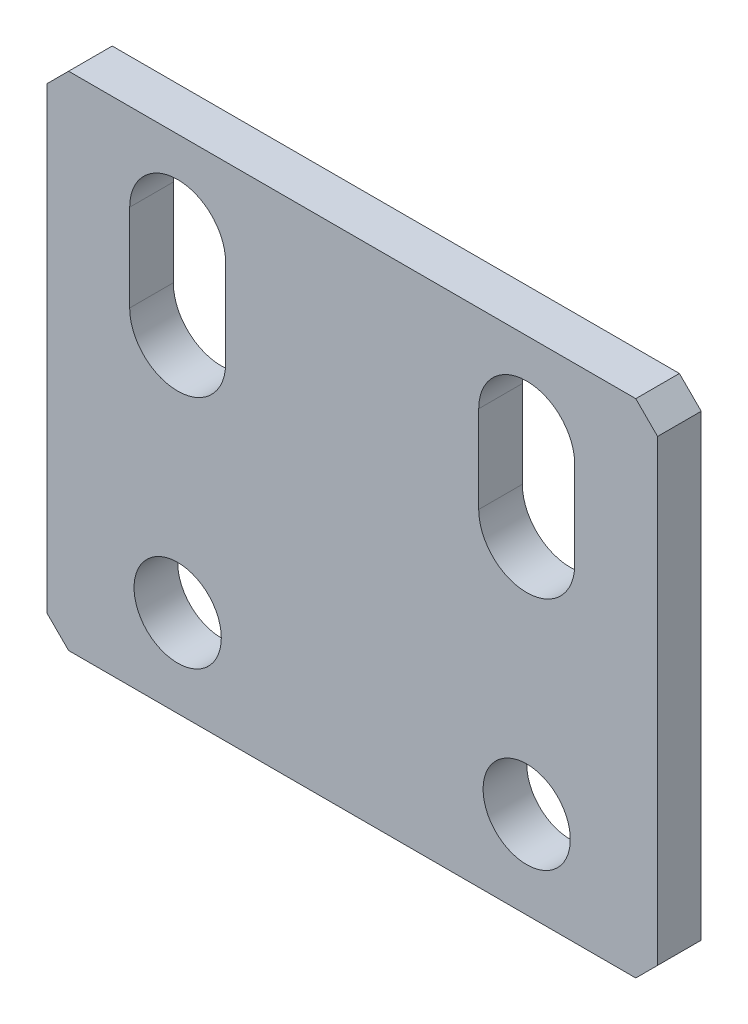
ISO-10303-21;
HEADER;
FILE_DESCRIPTION(('STEP AP214'),'2;1');
FILE_NAME('part.step','',(''),(''),'','','');
FILE_SCHEMA(('AUTOMOTIVE_DESIGN { 1 0 10303 214 1 1 1 1 }'));
ENDSEC;
DATA;
#1=APPLICATION_CONTEXT('core data for automotive mechanical design processes');
#2=APPLICATION_PROTOCOL_DEFINITION('international standard','automotive_design',2000,#1);
#3=PRODUCT_CONTEXT('',#1,'mechanical');
#4=PRODUCT('Part','Part','',(#3));
#5=PRODUCT_RELATED_PRODUCT_CATEGORY('part','',(#4));
#6=PRODUCT_DEFINITION_FORMATION('','',#4);
#7=PRODUCT_DEFINITION_CONTEXT('part definition',#1,'design');
#8=PRODUCT_DEFINITION('design','',#6,#7);
#9=PRODUCT_DEFINITION_SHAPE('','',#8);
#10=(LENGTH_UNIT() NAMED_UNIT(*) SI_UNIT(.MILLI.,.METRE.));
#11=(NAMED_UNIT(*) PLANE_ANGLE_UNIT() SI_UNIT($,.RADIAN.));
#12=(NAMED_UNIT(*) SI_UNIT($,.STERADIAN.) SOLID_ANGLE_UNIT());
#13=UNCERTAINTY_MEASURE_WITH_UNIT(LENGTH_MEASURE(1.E-05),#10,'distance_accuracy_value','');
#14=(GEOMETRIC_REPRESENTATION_CONTEXT(3) GLOBAL_UNCERTAINTY_ASSIGNED_CONTEXT((#13)) GLOBAL_UNIT_ASSIGNED_CONTEXT((#10,
#11,#12)) REPRESENTATION_CONTEXT('',''));
#15=CARTESIAN_POINT('',(0.,0.,0.));
#16=DIRECTION('',(0.,0.,1.));
#17=DIRECTION('',(1.,0.,0.));
#18=AXIS2_PLACEMENT_3D('',#15,#16,#17);
#19=CARTESIAN_POINT('',(0.,0.,2.));
#20=DIRECTION('',(1.,0.,0.));
#21=DIRECTION('',(0.,0.,-1.));
#22=AXIS2_PLACEMENT_3D('',#19,#20,#21);
#23=PLANE('',#22);
#24=DIRECTION('',(0.,-1.,0.));
#25=VECTOR('',#24,1.);
#26=CARTESIAN_POINT('',(0.,0.,2.));
#27=LINE('',#26,#25);
#28=CARTESIAN_POINT('',(0.,22.,2.));
#29=VERTEX_POINT('',#28);
#30=CARTESIAN_POINT('',(0.,1.00000000000001,2.));
#31=VERTEX_POINT('',#30);
#32=EDGE_CURVE('E235',#29,#31,#27,.T.);
#33=ORIENTED_EDGE('',*,*,#32,.F.);
#34=DIRECTION('',(0.,0.,-1.));
#35=VECTOR('',#34,1.);
#36=CARTESIAN_POINT('',(0.,22.,2.));
#37=LINE('',#36,#35);
#38=CARTESIAN_POINT('',(0.,22.,0.));
#39=VERTEX_POINT('',#38);
#40=EDGE_CURVE('E282',#29,#39,#37,.T.);
#41=ORIENTED_EDGE('',*,*,#40,.T.);
#42=DIRECTION('',(0.,-1.,0.));
#43=VECTOR('',#42,1.);
#44=CARTESIAN_POINT('',(0.,0.,0.));
#45=LINE('',#44,#43);
#46=CARTESIAN_POINT('',(0.,1.00000000000001,0.));
#47=VERTEX_POINT('',#46);
#48=EDGE_CURVE('E228',#39,#47,#45,.T.);
#49=ORIENTED_EDGE('',*,*,#48,.T.);
#50=DIRECTION('',(0.,0.,1.));
#51=VECTOR('',#50,1.);
#52=CARTESIAN_POINT('',(0.,1.00000000000001,2.));
#53=LINE('',#52,#51);
#54=EDGE_CURVE('E280',#47,#31,#53,.T.);
#55=ORIENTED_EDGE('',*,*,#54,.T.);
#56=EDGE_LOOP('',(#33,#41,#49,#55));
#57=FACE_BOUND('',#56,.T.);
#58=ADVANCED_FACE('F33',(#57),#23,.F.);
#59=CARTESIAN_POINT('',(0.,0.,2.));
#60=DIRECTION('',(0.,1.,0.));
#61=DIRECTION('',(0.,0.,1.));
#62=AXIS2_PLACEMENT_3D('',#59,#60,#61);
#63=PLANE('',#62);
#64=DIRECTION('',(1.,0.,0.));
#65=VECTOR('',#64,1.);
#66=CARTESIAN_POINT('',(0.,0.,2.));
#67=LINE('',#66,#65);
#68=CARTESIAN_POINT('',(1.,0.,2.));
#69=VERTEX_POINT('',#68);
#70=CARTESIAN_POINT('',(27.,0.,2.));
#71=VERTEX_POINT('',#70);
#72=EDGE_CURVE('E237',#69,#71,#67,.T.);
#73=ORIENTED_EDGE('',*,*,#72,.F.);
#74=DIRECTION('',(0.,0.,-1.));
#75=VECTOR('',#74,1.);
#76=CARTESIAN_POINT('',(1.,0.,2.));
#77=LINE('',#76,#75);
#78=CARTESIAN_POINT('',(1.,0.,0.));
#79=VERTEX_POINT('',#78);
#80=EDGE_CURVE('E11',#69,#79,#77,.T.);
#81=ORIENTED_EDGE('',*,*,#80,.T.);
#82=DIRECTION('',(1.,0.,0.));
#83=VECTOR('',#82,1.);
#84=CARTESIAN_POINT('',(0.,0.,0.));
#85=LINE('',#84,#83);
#86=CARTESIAN_POINT('',(27.,0.,0.));
#87=VERTEX_POINT('',#86);
#88=EDGE_CURVE('E249',#79,#87,#85,.T.);
#89=ORIENTED_EDGE('',*,*,#88,.T.);
#90=DIRECTION('',(0.,0.,1.));
#91=VECTOR('',#90,1.);
#92=CARTESIAN_POINT('',(27.,0.,2.));
#93=LINE('',#92,#91);
#94=EDGE_CURVE('E41',#87,#71,#93,.T.);
#95=ORIENTED_EDGE('',*,*,#94,.T.);
#96=EDGE_LOOP('',(#73,#81,#89,#95));
#97=FACE_BOUND('',#96,.T.);
#98=ADVANCED_FACE('F297',(#97),#63,.F.);
#99=CARTESIAN_POINT('',(28.,0.,2.));
#100=DIRECTION('',(-1.,0.,0.));
#101=DIRECTION('',(0.,0.,1.));
#102=AXIS2_PLACEMENT_3D('',#99,#100,#101);
#103=PLANE('',#102);
#104=DIRECTION('',(0.,1.,0.));
#105=VECTOR('',#104,1.);
#106=CARTESIAN_POINT('',(28.,0.,0.));
#107=LINE('',#106,#105);
#108=CARTESIAN_POINT('',(28.,1.,0.));
#109=VERTEX_POINT('',#108);
#110=CARTESIAN_POINT('',(28.,22.,0.));
#111=VERTEX_POINT('',#110);
#112=EDGE_CURVE('E251',#109,#111,#107,.T.);
#113=ORIENTED_EDGE('',*,*,#112,.T.);
#114=DIRECTION('',(0.,0.,1.));
#115=VECTOR('',#114,1.);
#116=CARTESIAN_POINT('',(28.,22.,2.));
#117=LINE('',#116,#115);
#118=CARTESIAN_POINT('',(28.,22.,2.));
#119=VERTEX_POINT('',#118);
#120=EDGE_CURVE('E271',#111,#119,#117,.T.);
#121=ORIENTED_EDGE('',*,*,#120,.T.);
#122=DIRECTION('',(0.,1.,0.));
#123=VECTOR('',#122,1.);
#124=CARTESIAN_POINT('',(28.,0.,2.));
#125=LINE('',#124,#123);
#126=CARTESIAN_POINT('',(28.,1.,2.));
#127=VERTEX_POINT('',#126);
#128=EDGE_CURVE('E240',#127,#119,#125,.T.);
#129=ORIENTED_EDGE('',*,*,#128,.F.);
#130=DIRECTION('',(0.,0.,-1.));
#131=VECTOR('',#130,1.);
#132=CARTESIAN_POINT('',(28.,1.,2.));
#133=LINE('',#132,#131);
#134=EDGE_CURVE('E268',#127,#109,#133,.T.);
#135=ORIENTED_EDGE('',*,*,#134,.T.);
#136=EDGE_LOOP('',(#113,#121,#129,#135));
#137=FACE_BOUND('',#136,.T.);
#138=ADVANCED_FACE('F305',(#137),#103,.F.);
#139=CARTESIAN_POINT('',(0.,23.,2.));
#140=DIRECTION('',(0.,-1.,0.));
#141=DIRECTION('',(0.,0.,-1.));
#142=AXIS2_PLACEMENT_3D('',#139,#140,#141);
#143=PLANE('',#142);
#144=DIRECTION('',(-1.,0.,0.));
#145=VECTOR('',#144,1.);
#146=CARTESIAN_POINT('',(0.,23.,2.));
#147=LINE('',#146,#145);
#148=CARTESIAN_POINT('',(27.,23.,2.));
#149=VERTEX_POINT('',#148);
#150=CARTESIAN_POINT('',(1.,23.,2.));
#151=VERTEX_POINT('',#150);
#152=EDGE_CURVE('E243',#149,#151,#147,.T.);
#153=ORIENTED_EDGE('',*,*,#152,.F.);
#154=DIRECTION('',(0.,0.,-1.));
#155=VECTOR('',#154,1.);
#156=CARTESIAN_POINT('',(27.,23.,2.));
#157=LINE('',#156,#155);
#158=CARTESIAN_POINT('',(27.,23.,0.));
#159=VERTEX_POINT('',#158);
#160=EDGE_CURVE('E257',#149,#159,#157,.T.);
#161=ORIENTED_EDGE('',*,*,#160,.T.);
#162=DIRECTION('',(-1.,0.,0.));
#163=VECTOR('',#162,1.);
#164=CARTESIAN_POINT('',(0.,23.,0.));
#165=LINE('',#164,#163);
#166=CARTESIAN_POINT('',(1.,23.,0.));
#167=VERTEX_POINT('',#166);
#168=EDGE_CURVE('E238',#159,#167,#165,.T.);
#169=ORIENTED_EDGE('',*,*,#168,.T.);
#170=DIRECTION('',(0.,0.,1.));
#171=VECTOR('',#170,1.);
#172=CARTESIAN_POINT('',(1.,23.,2.));
#173=LINE('',#172,#171);
#174=EDGE_CURVE('E246',#167,#151,#173,.T.);
#175=ORIENTED_EDGE('',*,*,#174,.T.);
#176=EDGE_LOOP('',(#153,#161,#169,#175));
#177=FACE_BOUND('',#176,.T.);
#178=ADVANCED_FACE('F313',(#177),#143,.F.);
#179=CARTESIAN_POINT('',(0.,0.,2.));
#180=DIRECTION('',(0.,0.,-1.));
#181=DIRECTION('',(-1.,0.,0.));
#182=AXIS2_PLACEMENT_3D('',#179,#180,#181);
#183=PLANE('',#182);
#184=DIRECTION('',(0.,-1.,0.));
#185=VECTOR('',#184,1.);
#186=CARTESIAN_POINT('',(19.8,19.,2.));
#187=LINE('',#186,#185);
#188=CARTESIAN_POINT('',(19.8,19.,2.));
#189=VERTEX_POINT('',#188);
#190=CARTESIAN_POINT('',(19.8,15.,2.));
#191=VERTEX_POINT('',#190);
#192=EDGE_CURVE('E181',#189,#191,#187,.T.);
#193=ORIENTED_EDGE('',*,*,#192,.F.);
#194=CARTESIAN_POINT('',(22.,19.,2.));
#195=DIRECTION('',(0.,0.,1.));
#196=DIRECTION('',(-1.,0.,0.));
#197=AXIS2_PLACEMENT_3D('',#194,#195,#196);
#198=CIRCLE('',#197,2.2);
#199=CARTESIAN_POINT('',(24.2,19.,2.));
#200=VERTEX_POINT('',#199);
#201=EDGE_CURVE('E154',#200,#189,#198,.T.);
#202=ORIENTED_EDGE('',*,*,#201,.F.);
#203=DIRECTION('',(0.,1.,0.));
#204=VECTOR('',#203,1.);
#205=CARTESIAN_POINT('',(24.2,19.,2.));
#206=LINE('',#205,#204);
#207=CARTESIAN_POINT('',(24.2,15.,2.));
#208=VERTEX_POINT('',#207);
#209=EDGE_CURVE('E172',#208,#200,#206,.T.);
#210=ORIENTED_EDGE('',*,*,#209,.F.);
#211=CARTESIAN_POINT('',(22.,15.,2.));
#212=DIRECTION('',(0.,0.,1.));
#213=DIRECTION('',(-1.,0.,0.));
#214=AXIS2_PLACEMENT_3D('',#211,#212,#213);
#215=CIRCLE('',#214,2.2);
#216=EDGE_CURVE('E175',#191,#208,#215,.T.);
#217=ORIENTED_EDGE('',*,*,#216,.F.);
#218=EDGE_LOOP('',(#193,#202,#210,#217));
#219=FACE_BOUND('',#218,.T.);
#220=CARTESIAN_POINT('',(6.,4.,2.));
#221=DIRECTION('',(0.,0.,1.));
#222=DIRECTION('',(1.,0.,0.));
#223=AXIS2_PLACEMENT_3D('',#220,#221,#222);
#224=CIRCLE('',#223,2.);
#225=CARTESIAN_POINT('',(8.,4.,2.));
#226=VERTEX_POINT('',#225);
#227=EDGE_CURVE('E194',#226,#226,#224,.T.);
#228=ORIENTED_EDGE('',*,*,#227,.F.);
#229=EDGE_LOOP('',(#228));
#230=FACE_BOUND('',#229,.T.);
#231=CARTESIAN_POINT('',(22.,4.,2.));
#232=DIRECTION('',(0.,0.,1.));
#233=DIRECTION('',(-1.,0.,0.));
#234=AXIS2_PLACEMENT_3D('',#231,#232,#233);
#235=CIRCLE('',#234,2.);
#236=CARTESIAN_POINT('',(20.,4.,2.));
#237=VERTEX_POINT('',#236);
#238=EDGE_CURVE('E200',#237,#237,#235,.T.);
#239=ORIENTED_EDGE('',*,*,#238,.F.);
#240=EDGE_LOOP('',(#239));
#241=FACE_BOUND('',#240,.T.);
#242=DIRECTION('',(0.,-1.,0.));
#243=VECTOR('',#242,1.);
#244=CARTESIAN_POINT('',(3.8,19.,2.));
#245=LINE('',#244,#243);
#246=CARTESIAN_POINT('',(3.8,19.,2.));
#247=VERTEX_POINT('',#246);
#248=CARTESIAN_POINT('',(3.8,15.,2.));
#249=VERTEX_POINT('',#248);
#250=EDGE_CURVE('E218',#247,#249,#245,.T.);
#251=ORIENTED_EDGE('',*,*,#250,.F.);
#252=CARTESIAN_POINT('',(6.,19.,2.));
#253=DIRECTION('',(0.,0.,1.));
#254=DIRECTION('',(1.,0.,0.));
#255=AXIS2_PLACEMENT_3D('',#252,#253,#254);
#256=CIRCLE('',#255,2.2);
#257=CARTESIAN_POINT('',(8.2,19.,2.));
#258=VERTEX_POINT('',#257);
#259=EDGE_CURVE('E188',#258,#247,#256,.T.);
#260=ORIENTED_EDGE('',*,*,#259,.F.);
#261=DIRECTION('',(0.,1.,0.));
#262=VECTOR('',#261,1.);
#263=CARTESIAN_POINT('',(8.2,19.,2.));
#264=LINE('',#263,#262);
#265=CARTESIAN_POINT('',(8.2,15.,2.));
#266=VERTEX_POINT('',#265);
#267=EDGE_CURVE('E207',#266,#258,#264,.T.);
#268=ORIENTED_EDGE('',*,*,#267,.F.);
#269=CARTESIAN_POINT('',(6.,15.,2.));
#270=DIRECTION('',(0.,0.,1.));
#271=DIRECTION('',(1.,0.,0.));
#272=AXIS2_PLACEMENT_3D('',#269,#270,#271);
#273=CIRCLE('',#272,2.2);
#274=EDGE_CURVE('E221',#249,#266,#273,.T.);
#275=ORIENTED_EDGE('',*,*,#274,.F.);
#276=EDGE_LOOP('',(#251,#260,#268,#275));
#277=FACE_BOUND('',#276,.T.);
#278=ORIENTED_EDGE('',*,*,#128,.T.);
#279=DIRECTION('',(0.707106781186546,-0.707106781186549,0.));
#280=VECTOR('',#279,1.);
#281=CARTESIAN_POINT('',(27.,23.,2.));
#282=LINE('',#281,#280);
#283=EDGE_CURVE('E278',#119,#149,#282,.F.);
#284=ORIENTED_EDGE('',*,*,#283,.T.);
#285=ORIENTED_EDGE('',*,*,#152,.T.);
#286=DIRECTION('',(0.707106781186548,0.707106781186548,0.));
#287=VECTOR('',#286,1.);
#288=CARTESIAN_POINT('',(0.,22.,2.));
#289=LINE('',#288,#287);
#290=EDGE_CURVE('E276',#151,#29,#289,.F.);
#291=ORIENTED_EDGE('',*,*,#290,.T.);
#292=ORIENTED_EDGE('',*,*,#32,.T.);
#293=DIRECTION('',(-0.707106781186546,0.707106781186549,0.));
#294=VECTOR('',#293,1.);
#295=CARTESIAN_POINT('',(1.,0.,2.));
#296=LINE('',#295,#294);
#297=EDGE_CURVE('E54',#31,#69,#296,.F.);
#298=ORIENTED_EDGE('',*,*,#297,.T.);
#299=ORIENTED_EDGE('',*,*,#72,.T.);
#300=DIRECTION('',(-0.707106781186549,-0.707106781186546,0.));
#301=VECTOR('',#300,1.);
#302=CARTESIAN_POINT('',(28.,1.,2.));
#303=LINE('',#302,#301);
#304=EDGE_CURVE('E273',#71,#127,#303,.F.);
#305=ORIENTED_EDGE('',*,*,#304,.T.);
#306=EDGE_LOOP('',(#278,#284,#285,#291,#292,#298,#299,#305));
#307=FACE_BOUND('',#306,.T.);
#308=ADVANCED_FACE('F299',(#219,#230,#241,#277,#307),#183,.F.);
#309=CARTESIAN_POINT('',(0.,0.,0.));
#310=DIRECTION('',(0.,0.,-1.));
#311=DIRECTION('',(-1.,0.,0.));
#312=AXIS2_PLACEMENT_3D('',#309,#310,#311);
#313=PLANE('',#312);
#314=CARTESIAN_POINT('',(22.,19.,0.));
#315=DIRECTION('',(0.,0.,1.));
#316=DIRECTION('',(-1.,0.,0.));
#317=AXIS2_PLACEMENT_3D('',#314,#315,#316);
#318=CIRCLE('',#317,2.2);
#319=CARTESIAN_POINT('',(24.2,19.,0.));
#320=VERTEX_POINT('',#319);
#321=CARTESIAN_POINT('',(19.8,19.,0.));
#322=VERTEX_POINT('',#321);
#323=EDGE_CURVE('E151',#320,#322,#318,.T.);
#324=ORIENTED_EDGE('',*,*,#323,.T.);
#325=DIRECTION('',(0.,-1.,0.));
#326=VECTOR('',#325,1.);
#327=CARTESIAN_POINT('',(19.8,19.,0.));
#328=LINE('',#327,#326);
#329=CARTESIAN_POINT('',(19.8,15.,0.));
#330=VERTEX_POINT('',#329);
#331=EDGE_CURVE('E163',#322,#330,#328,.T.);
#332=ORIENTED_EDGE('',*,*,#331,.T.);
#333=CARTESIAN_POINT('',(22.,15.,0.));
#334=DIRECTION('',(0.,0.,1.));
#335=DIRECTION('',(-1.,0.,0.));
#336=AXIS2_PLACEMENT_3D('',#333,#334,#335);
#337=CIRCLE('',#336,2.2);
#338=CARTESIAN_POINT('',(24.2,15.,0.));
#339=VERTEX_POINT('',#338);
#340=EDGE_CURVE('E167',#330,#339,#337,.T.);
#341=ORIENTED_EDGE('',*,*,#340,.T.);
#342=DIRECTION('',(0.,1.,0.));
#343=VECTOR('',#342,1.);
#344=CARTESIAN_POINT('',(24.2,19.,0.));
#345=LINE('',#344,#343);
#346=EDGE_CURVE('E159',#339,#320,#345,.T.);
#347=ORIENTED_EDGE('',*,*,#346,.T.);
#348=EDGE_LOOP('',(#324,#332,#341,#347));
#349=FACE_BOUND('',#348,.T.);
#350=CARTESIAN_POINT('',(6.,4.,0.));
#351=DIRECTION('',(0.,0.,1.));
#352=DIRECTION('',(1.,0.,0.));
#353=AXIS2_PLACEMENT_3D('',#350,#351,#352);
#354=CIRCLE('',#353,2.);
#355=CARTESIAN_POINT('',(8.,4.,0.));
#356=VERTEX_POINT('',#355);
#357=EDGE_CURVE('E182',#356,#356,#354,.T.);
#358=ORIENTED_EDGE('',*,*,#357,.T.);
#359=EDGE_LOOP('',(#358));
#360=FACE_BOUND('',#359,.T.);
#361=CARTESIAN_POINT('',(22.,4.,0.));
#362=DIRECTION('',(0.,0.,1.));
#363=DIRECTION('',(-1.,0.,0.));
#364=AXIS2_PLACEMENT_3D('',#361,#362,#363);
#365=CIRCLE('',#364,2.);
#366=CARTESIAN_POINT('',(20.,4.,0.));
#367=VERTEX_POINT('',#366);
#368=EDGE_CURVE('E197',#367,#367,#365,.T.);
#369=ORIENTED_EDGE('',*,*,#368,.T.);
#370=EDGE_LOOP('',(#369));
#371=FACE_BOUND('',#370,.T.);
#372=CARTESIAN_POINT('',(6.,19.,0.));
#373=DIRECTION('',(0.,0.,1.));
#374=DIRECTION('',(1.,0.,0.));
#375=AXIS2_PLACEMENT_3D('',#372,#373,#374);
#376=CIRCLE('',#375,2.2);
#377=CARTESIAN_POINT('',(8.2,19.,0.));
#378=VERTEX_POINT('',#377);
#379=CARTESIAN_POINT('',(3.8,19.,0.));
#380=VERTEX_POINT('',#379);
#381=EDGE_CURVE('E203',#378,#380,#376,.T.);
#382=ORIENTED_EDGE('',*,*,#381,.T.);
#383=DIRECTION('',(0.,-1.,0.));
#384=VECTOR('',#383,1.);
#385=CARTESIAN_POINT('',(3.8,19.,0.));
#386=LINE('',#385,#384);
#387=CARTESIAN_POINT('',(3.8,15.,0.));
#388=VERTEX_POINT('',#387);
#389=EDGE_CURVE('E206',#380,#388,#386,.T.);
#390=ORIENTED_EDGE('',*,*,#389,.T.);
#391=CARTESIAN_POINT('',(6.,15.,0.));
#392=DIRECTION('',(0.,0.,1.));
#393=DIRECTION('',(1.,0.,0.));
#394=AXIS2_PLACEMENT_3D('',#391,#392,#393);
#395=CIRCLE('',#394,2.2);
#396=CARTESIAN_POINT('',(8.2,15.,0.));
#397=VERTEX_POINT('',#396);
#398=EDGE_CURVE('E210',#388,#397,#395,.T.);
#399=ORIENTED_EDGE('',*,*,#398,.T.);
#400=DIRECTION('',(0.,1.,0.));
#401=VECTOR('',#400,1.);
#402=CARTESIAN_POINT('',(8.2,19.,0.));
#403=LINE('',#402,#401);
#404=EDGE_CURVE('E213',#397,#378,#403,.T.);
#405=ORIENTED_EDGE('',*,*,#404,.T.);
#406=EDGE_LOOP('',(#382,#390,#399,#405));
#407=FACE_BOUND('',#406,.T.);
#408=ORIENTED_EDGE('',*,*,#168,.F.);
#409=DIRECTION('',(-0.707106781186546,0.707106781186549,0.));
#410=VECTOR('',#409,1.);
#411=CARTESIAN_POINT('',(25.,25.,0.));
#412=LINE('',#411,#410);
#413=EDGE_CURVE('E266',#159,#111,#412,.F.);
#414=ORIENTED_EDGE('',*,*,#413,.T.);
#415=ORIENTED_EDGE('',*,*,#112,.F.);
#416=DIRECTION('',(0.707106781186549,0.707106781186546,0.));
#417=VECTOR('',#416,1.);
#418=CARTESIAN_POINT('',(13.5,-13.5,0.));
#419=LINE('',#418,#417);
#420=EDGE_CURVE('E260',#109,#87,#419,.F.);
#421=ORIENTED_EDGE('',*,*,#420,.T.);
#422=ORIENTED_EDGE('',*,*,#88,.F.);
#423=DIRECTION('',(0.707106781186546,-0.707106781186549,0.));
#424=VECTOR('',#423,1.);
#425=CARTESIAN_POINT('',(0.500000000000004,0.500000000000002,0.));
#426=LINE('',#425,#424);
#427=EDGE_CURVE('E262',#79,#47,#426,.F.);
#428=ORIENTED_EDGE('',*,*,#427,.T.);
#429=ORIENTED_EDGE('',*,*,#48,.F.);
#430=DIRECTION('',(-0.707106781186548,-0.707106781186548,0.));
#431=VECTOR('',#430,1.);
#432=CARTESIAN_POINT('',(-11.,11.,0.));
#433=LINE('',#432,#431);
#434=EDGE_CURVE('E264',#39,#167,#433,.F.);
#435=ORIENTED_EDGE('',*,*,#434,.T.);
#436=EDGE_LOOP('',(#408,#414,#415,#421,#422,#428,#429,#435));
#437=FACE_BOUND('',#436,.T.);
#438=ADVANCED_FACE('F169',(#349,#360,#371,#407,#437),#313,.T.);
#439=CARTESIAN_POINT('',(6.,19.,0.));
#440=DIRECTION('',(0.,0.,1.));
#441=DIRECTION('',(1.,0.,0.));
#442=AXIS2_PLACEMENT_3D('',#439,#440,#441);
#443=CYLINDRICAL_SURFACE('',#442,2.2);
#444=ORIENTED_EDGE('',*,*,#259,.T.);
#445=DIRECTION('',(0.,0.,1.));
#446=VECTOR('',#445,1.);
#447=CARTESIAN_POINT('',(3.8,19.,0.));
#448=LINE('',#447,#446);
#449=EDGE_CURVE('E216',#380,#247,#448,.T.);
#450=ORIENTED_EDGE('',*,*,#449,.F.);
#451=ORIENTED_EDGE('',*,*,#381,.F.);
#452=DIRECTION('',(0.,0.,1.));
#453=VECTOR('',#452,1.);
#454=CARTESIAN_POINT('',(8.2,19.,0.));
#455=LINE('',#454,#453);
#456=EDGE_CURVE('E226',#378,#258,#455,.T.);
#457=ORIENTED_EDGE('',*,*,#456,.T.);
#458=EDGE_LOOP('',(#444,#450,#451,#457));
#459=FACE_BOUND('',#458,.T.);
#460=ADVANCED_FACE('F337',(#459),#443,.F.);
#461=CARTESIAN_POINT('',(8.2,19.,0.));
#462=DIRECTION('',(1.,0.,0.));
#463=DIRECTION('',(0.,1.,0.));
#464=AXIS2_PLACEMENT_3D('',#461,#462,#463);
#465=PLANE('',#464);
#466=ORIENTED_EDGE('',*,*,#267,.T.);
#467=ORIENTED_EDGE('',*,*,#456,.F.);
#468=ORIENTED_EDGE('',*,*,#404,.F.);
#469=DIRECTION('',(0.,0.,1.));
#470=VECTOR('',#469,1.);
#471=CARTESIAN_POINT('',(8.2,15.,0.));
#472=LINE('',#471,#470);
#473=EDGE_CURVE('E229',#397,#266,#472,.T.);
#474=ORIENTED_EDGE('',*,*,#473,.T.);
#475=EDGE_LOOP('',(#466,#467,#468,#474));
#476=FACE_BOUND('',#475,.T.);
#477=ADVANCED_FACE('F343',(#476),#465,.F.);
#478=CARTESIAN_POINT('',(6.,15.,0.));
#479=DIRECTION('',(0.,0.,1.));
#480=DIRECTION('',(1.,0.,0.));
#481=AXIS2_PLACEMENT_3D('',#478,#479,#480);
#482=CYLINDRICAL_SURFACE('',#481,2.2);
#483=ORIENTED_EDGE('',*,*,#274,.T.);
#484=ORIENTED_EDGE('',*,*,#473,.F.);
#485=ORIENTED_EDGE('',*,*,#398,.F.);
#486=DIRECTION('',(0.,0.,1.));
#487=VECTOR('',#486,1.);
#488=CARTESIAN_POINT('',(3.8,15.,0.));
#489=LINE('',#488,#487);
#490=EDGE_CURVE('E231',#388,#249,#489,.T.);
#491=ORIENTED_EDGE('',*,*,#490,.T.);
#492=EDGE_LOOP('',(#483,#484,#485,#491));
#493=FACE_BOUND('',#492,.T.);
#494=ADVANCED_FACE('F349',(#493),#482,.F.);
#495=CARTESIAN_POINT('',(3.8,19.,0.));
#496=DIRECTION('',(-1.,0.,0.));
#497=DIRECTION('',(0.,-1.,0.));
#498=AXIS2_PLACEMENT_3D('',#495,#496,#497);
#499=PLANE('',#498);
#500=ORIENTED_EDGE('',*,*,#250,.T.);
#501=ORIENTED_EDGE('',*,*,#490,.F.);
#502=ORIENTED_EDGE('',*,*,#389,.F.);
#503=ORIENTED_EDGE('',*,*,#449,.T.);
#504=EDGE_LOOP('',(#500,#501,#502,#503));
#505=FACE_BOUND('',#504,.T.);
#506=ADVANCED_FACE('F345',(#505),#499,.F.);
#507=CARTESIAN_POINT('',(22.,4.,0.));
#508=DIRECTION('',(0.,0.,1.));
#509=DIRECTION('',(1.,0.,0.));
#510=AXIS2_PLACEMENT_3D('',#507,#508,#509);
#511=CYLINDRICAL_SURFACE('',#510,2.);
#512=ORIENTED_EDGE('',*,*,#368,.F.);
#513=EDGE_LOOP('',(#512));
#514=FACE_BOUND('',#513,.T.);
#515=ORIENTED_EDGE('',*,*,#238,.T.);
#516=EDGE_LOOP('',(#515));
#517=FACE_BOUND('',#516,.T.);
#518=ADVANCED_FACE('F348',(#514,#517),#511,.F.);
#519=CARTESIAN_POINT('',(6.,4.,0.));
#520=DIRECTION('',(0.,0.,1.));
#521=DIRECTION('',(1.,0.,0.));
#522=AXIS2_PLACEMENT_3D('',#519,#520,#521);
#523=CYLINDRICAL_SURFACE('',#522,2.);
#524=ORIENTED_EDGE('',*,*,#357,.F.);
#525=EDGE_LOOP('',(#524));
#526=FACE_BOUND('',#525,.T.);
#527=ORIENTED_EDGE('',*,*,#227,.T.);
#528=EDGE_LOOP('',(#527));
#529=FACE_BOUND('',#528,.T.);
#530=ADVANCED_FACE('F359',(#526,#529),#523,.F.);
#531=CARTESIAN_POINT('',(22.,19.,0.));
#532=DIRECTION('',(0.,0.,1.));
#533=DIRECTION('',(1.,0.,0.));
#534=AXIS2_PLACEMENT_3D('',#531,#532,#533);
#535=CYLINDRICAL_SURFACE('',#534,2.2);
#536=ORIENTED_EDGE('',*,*,#201,.T.);
#537=DIRECTION('',(0.,0.,1.));
#538=VECTOR('',#537,1.);
#539=CARTESIAN_POINT('',(19.8,19.,0.));
#540=LINE('',#539,#538);
#541=EDGE_CURVE('E147',#322,#189,#540,.T.);
#542=ORIENTED_EDGE('',*,*,#541,.F.);
#543=ORIENTED_EDGE('',*,*,#323,.F.);
#544=DIRECTION('',(0.,0.,1.));
#545=VECTOR('',#544,1.);
#546=CARTESIAN_POINT('',(24.2,19.,0.));
#547=LINE('',#546,#545);
#548=EDGE_CURVE('E186',#320,#200,#547,.T.);
#549=ORIENTED_EDGE('',*,*,#548,.T.);
#550=EDGE_LOOP('',(#536,#542,#543,#549));
#551=FACE_BOUND('',#550,.T.);
#552=ADVANCED_FACE('F149',(#551),#535,.F.);
#553=CARTESIAN_POINT('',(24.2,19.,0.));
#554=DIRECTION('',(1.,0.,0.));
#555=DIRECTION('',(0.,0.,-1.));
#556=AXIS2_PLACEMENT_3D('',#553,#554,#555);
#557=PLANE('',#556);
#558=ORIENTED_EDGE('',*,*,#209,.T.);
#559=ORIENTED_EDGE('',*,*,#548,.F.);
#560=ORIENTED_EDGE('',*,*,#346,.F.);
#561=DIRECTION('',(0.,0.,1.));
#562=VECTOR('',#561,1.);
#563=CARTESIAN_POINT('',(24.2,15.,0.));
#564=LINE('',#563,#562);
#565=EDGE_CURVE('E189',#339,#208,#564,.T.);
#566=ORIENTED_EDGE('',*,*,#565,.T.);
#567=EDGE_LOOP('',(#558,#559,#560,#566));
#568=FACE_BOUND('',#567,.T.);
#569=ADVANCED_FACE('F366',(#568),#557,.F.);
#570=CARTESIAN_POINT('',(22.,15.,0.));
#571=DIRECTION('',(0.,0.,1.));
#572=DIRECTION('',(1.,0.,0.));
#573=AXIS2_PLACEMENT_3D('',#570,#571,#572);
#574=CYLINDRICAL_SURFACE('',#573,2.2);
#575=ORIENTED_EDGE('',*,*,#216,.T.);
#576=ORIENTED_EDGE('',*,*,#565,.F.);
#577=ORIENTED_EDGE('',*,*,#340,.F.);
#578=DIRECTION('',(0.,0.,1.));
#579=VECTOR('',#578,1.);
#580=CARTESIAN_POINT('',(19.8,15.,0.));
#581=LINE('',#580,#579);
#582=EDGE_CURVE('E158',#330,#191,#581,.T.);
#583=ORIENTED_EDGE('',*,*,#582,.T.);
#584=EDGE_LOOP('',(#575,#576,#577,#583));
#585=FACE_BOUND('',#584,.T.);
#586=ADVANCED_FACE('F369',(#585),#574,.F.);
#587=CARTESIAN_POINT('',(19.8,19.,0.));
#588=DIRECTION('',(-1.,0.,0.));
#589=DIRECTION('',(0.,0.,1.));
#590=AXIS2_PLACEMENT_3D('',#587,#588,#589);
#591=PLANE('',#590);
#592=ORIENTED_EDGE('',*,*,#192,.T.);
#593=ORIENTED_EDGE('',*,*,#582,.F.);
#594=ORIENTED_EDGE('',*,*,#331,.F.);
#595=ORIENTED_EDGE('',*,*,#541,.T.);
#596=EDGE_LOOP('',(#592,#593,#594,#595));
#597=FACE_BOUND('',#596,.T.);
#598=ADVANCED_FACE('F164',(#597),#591,.F.);
#599=CARTESIAN_POINT('',(27.,23.,2.));
#600=DIRECTION('',(-0.707106781186549,-0.707106781186546,0.));
#601=DIRECTION('',(0.,0.,-1.));
#602=AXIS2_PLACEMENT_3D('',#599,#600,#601);
#603=PLANE('',#602);
#604=ORIENTED_EDGE('',*,*,#283,.F.);
#605=ORIENTED_EDGE('',*,*,#120,.F.);
#606=ORIENTED_EDGE('',*,*,#413,.F.);
#607=ORIENTED_EDGE('',*,*,#160,.F.);
#608=EDGE_LOOP('',(#604,#605,#606,#607));
#609=FACE_BOUND('',#608,.T.);
#610=ADVANCED_FACE('F310',(#609),#603,.F.);
#611=CARTESIAN_POINT('',(0.,22.,2.));
#612=DIRECTION('',(0.707106781186547,-0.707106781186547,0.));
#613=DIRECTION('',(0.,0.,-1.));
#614=AXIS2_PLACEMENT_3D('',#611,#612,#613);
#615=PLANE('',#614);
#616=ORIENTED_EDGE('',*,*,#290,.F.);
#617=ORIENTED_EDGE('',*,*,#174,.F.);
#618=ORIENTED_EDGE('',*,*,#434,.F.);
#619=ORIENTED_EDGE('',*,*,#40,.F.);
#620=EDGE_LOOP('',(#616,#617,#618,#619));
#621=FACE_BOUND('',#620,.T.);
#622=ADVANCED_FACE('F315',(#621),#615,.F.);
#623=CARTESIAN_POINT('',(1.,0.,2.));
#624=DIRECTION('',(0.707106781186549,0.707106781186546,0.));
#625=DIRECTION('',(0.,0.,-1.));
#626=AXIS2_PLACEMENT_3D('',#623,#624,#625);
#627=PLANE('',#626);
#628=ORIENTED_EDGE('',*,*,#297,.F.);
#629=ORIENTED_EDGE('',*,*,#54,.F.);
#630=ORIENTED_EDGE('',*,*,#427,.F.);
#631=ORIENTED_EDGE('',*,*,#80,.F.);
#632=EDGE_LOOP('',(#628,#629,#630,#631));
#633=FACE_BOUND('',#632,.T.);
#634=ADVANCED_FACE('F296',(#633),#627,.F.);
#635=CARTESIAN_POINT('',(28.,1.,2.));
#636=DIRECTION('',(-0.707106781186546,0.707106781186549,0.));
#637=DIRECTION('',(0.,0.,-1.));
#638=AXIS2_PLACEMENT_3D('',#635,#636,#637);
#639=PLANE('',#638);
#640=ORIENTED_EDGE('',*,*,#304,.F.);
#641=ORIENTED_EDGE('',*,*,#94,.F.);
#642=ORIENTED_EDGE('',*,*,#420,.F.);
#643=ORIENTED_EDGE('',*,*,#134,.F.);
#644=EDGE_LOOP('',(#640,#641,#642,#643));
#645=FACE_BOUND('',#644,.T.);
#646=ADVANCED_FACE('F35',(#645),#639,.F.);
#647=CLOSED_SHELL('',(#58,#98,#138,#178,#308,#438,#460,#477,#494,#506,#518,#530,#552,#569,#586,
#598,#610,#622,#634,#646));
#648=MANIFOLD_SOLID_BREP('B2',#647);
#649=ADVANCED_BREP_SHAPE_REPRESENTATION('',(#18,#648),#14);
#650=SHAPE_DEFINITION_REPRESENTATION(#9,#649);
ENDSEC;
END-ISO-10303-21;
